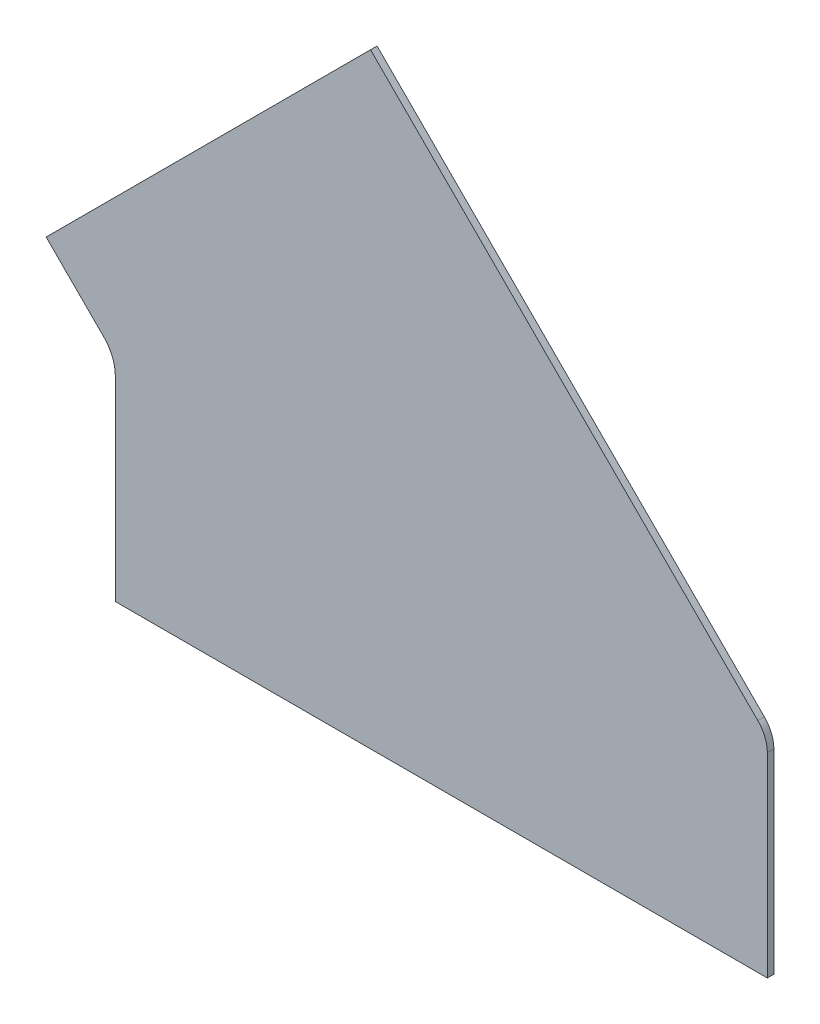
ISO-10303-21;
HEADER;
FILE_DESCRIPTION(('STEP AP214'),'2;1');
FILE_NAME('part.step','',(''),(''),'','','');
FILE_SCHEMA(('AUTOMOTIVE_DESIGN { 1 0 10303 214 1 1 1 1 }'));
ENDSEC;
DATA;
#1=APPLICATION_CONTEXT('core data for automotive mechanical design processes');
#2=APPLICATION_PROTOCOL_DEFINITION('international standard','automotive_design',2000,#1);
#3=PRODUCT_CONTEXT('',#1,'mechanical');
#4=PRODUCT('Part','Part','',(#3));
#5=PRODUCT_RELATED_PRODUCT_CATEGORY('part','',(#4));
#6=PRODUCT_DEFINITION_FORMATION('','',#4);
#7=PRODUCT_DEFINITION_CONTEXT('part definition',#1,'design');
#8=PRODUCT_DEFINITION('design','',#6,#7);
#9=PRODUCT_DEFINITION_SHAPE('','',#8);
#10=(LENGTH_UNIT() NAMED_UNIT(*) SI_UNIT(.MILLI.,.METRE.));
#11=(NAMED_UNIT(*) PLANE_ANGLE_UNIT() SI_UNIT($,.RADIAN.));
#12=(NAMED_UNIT(*) SI_UNIT($,.STERADIAN.) SOLID_ANGLE_UNIT());
#13=UNCERTAINTY_MEASURE_WITH_UNIT(LENGTH_MEASURE(1.E-05),#10,'distance_accuracy_value','');
#14=(GEOMETRIC_REPRESENTATION_CONTEXT(3) GLOBAL_UNCERTAINTY_ASSIGNED_CONTEXT((#13)) GLOBAL_UNIT_ASSIGNED_CONTEXT((#10,
#11,#12)) REPRESENTATION_CONTEXT('',''));
#15=CARTESIAN_POINT('',(0.,0.,0.));
#16=DIRECTION('',(0.,0.,1.));
#17=DIRECTION('',(1.,0.,0.));
#18=AXIS2_PLACEMENT_3D('',#15,#16,#17);
#19=CARTESIAN_POINT('',(0.,65.,2.));
#20=DIRECTION('',(1.,0.,0.));
#21=DIRECTION('',(0.,1.,0.));
#22=AXIS2_PLACEMENT_3D('',#19,#20,#21);
#23=PLANE('',#22);
#24=DIRECTION('',(0.,-1.,0.));
#25=VECTOR('',#24,1.);
#26=CARTESIAN_POINT('',(0.,65.,2.));
#27=LINE('',#26,#25);
#28=CARTESIAN_POINT('',(0.,60.0294372515228,2.));
#29=VERTEX_POINT('',#28);
#30=CARTESIAN_POINT('',(0.,0.,2.));
#31=VERTEX_POINT('',#30);
#32=EDGE_CURVE('E102',#29,#31,#27,.T.);
#33=ORIENTED_EDGE('',*,*,#32,.F.);
#34=DIRECTION('',(0.,0.,-1.));
#35=VECTOR('',#34,1.);
#36=CARTESIAN_POINT('',(0.,60.0294372515228,0.));
#37=LINE('',#36,#35);
#38=CARTESIAN_POINT('',(0.,60.0294372515228,0.));
#39=VERTEX_POINT('',#38);
#40=EDGE_CURVE('E140',#29,#39,#37,.T.);
#41=ORIENTED_EDGE('',*,*,#40,.T.);
#42=DIRECTION('',(0.,-1.,0.));
#43=VECTOR('',#42,1.);
#44=CARTESIAN_POINT('',(0.,65.,0.));
#45=LINE('',#44,#43);
#46=CARTESIAN_POINT('',(0.,0.,0.));
#47=VERTEX_POINT('',#46);
#48=EDGE_CURVE('E124',#39,#47,#45,.T.);
#49=ORIENTED_EDGE('',*,*,#48,.T.);
#50=DIRECTION('',(0.,0.,-1.));
#51=VECTOR('',#50,1.);
#52=CARTESIAN_POINT('',(0.,0.,2.));
#53=LINE('',#52,#51);
#54=EDGE_CURVE('E118',#31,#47,#53,.T.);
#55=ORIENTED_EDGE('',*,*,#54,.F.);
#56=EDGE_LOOP('',(#33,#41,#49,#55));
#57=FACE_BOUND('',#56,.T.);
#58=ADVANCED_FACE('F38',(#57),#23,.F.);
#59=CARTESIAN_POINT('',(0.,0.,2.));
#60=DIRECTION('',(0.,1.,0.));
#61=DIRECTION('',(0.,0.,1.));
#62=AXIS2_PLACEMENT_3D('',#59,#60,#61);
#63=PLANE('',#62);
#64=DIRECTION('',(1.,0.,0.));
#65=VECTOR('',#64,1.);
#66=CARTESIAN_POINT('',(0.,0.,0.));
#67=LINE('',#66,#65);
#68=CARTESIAN_POINT('',(200.,0.,0.));
#69=VERTEX_POINT('',#68);
#70=EDGE_CURVE('E146',#47,#69,#67,.T.);
#71=ORIENTED_EDGE('',*,*,#70,.T.);
#72=DIRECTION('',(0.,0.,-1.));
#73=VECTOR('',#72,1.);
#74=CARTESIAN_POINT('',(200.,0.,2.));
#75=LINE('',#74,#73);
#76=CARTESIAN_POINT('',(200.,0.,2.));
#77=VERTEX_POINT('',#76);
#78=EDGE_CURVE('E120',#77,#69,#75,.T.);
#79=ORIENTED_EDGE('',*,*,#78,.F.);
#80=DIRECTION('',(1.,0.,0.));
#81=VECTOR('',#80,1.);
#82=CARTESIAN_POINT('',(0.,0.,2.));
#83=LINE('',#82,#81);
#84=EDGE_CURVE('E106',#31,#77,#83,.T.);
#85=ORIENTED_EDGE('',*,*,#84,.F.);
#86=ORIENTED_EDGE('',*,*,#54,.T.);
#87=EDGE_LOOP('',(#71,#79,#85,#86));
#88=FACE_BOUND('',#87,.T.);
#89=ADVANCED_FACE('F117',(#88),#63,.F.);
#90=CARTESIAN_POINT('',(200.,0.,2.));
#91=DIRECTION('',(-1.,0.,0.));
#92=DIRECTION('',(0.,-1.,0.));
#93=AXIS2_PLACEMENT_3D('',#90,#91,#92);
#94=PLANE('',#93);
#95=DIRECTION('',(0.,1.,0.));
#96=VECTOR('',#95,1.);
#97=CARTESIAN_POINT('',(200.,0.,0.));
#98=LINE('',#97,#96);
#99=CARTESIAN_POINT('',(200.,59.857864376269,0.));
#100=VERTEX_POINT('',#99);
#101=EDGE_CURVE('E148',#69,#100,#98,.T.);
#102=ORIENTED_EDGE('',*,*,#101,.T.);
#103=DIRECTION('',(0.,0.,-1.));
#104=VECTOR('',#103,1.);
#105=CARTESIAN_POINT('',(200.,59.857864376269,2.));
#106=LINE('',#105,#104);
#107=CARTESIAN_POINT('',(200.,59.857864376269,2.));
#108=VERTEX_POINT('',#107);
#109=EDGE_CURVE('E136',#100,#108,#106,.F.);
#110=ORIENTED_EDGE('',*,*,#109,.T.);
#111=DIRECTION('',(0.,1.,0.));
#112=VECTOR('',#111,1.);
#113=CARTESIAN_POINT('',(200.,0.,2.));
#114=LINE('',#113,#112);
#115=EDGE_CURVE('E122',#77,#108,#114,.T.);
#116=ORIENTED_EDGE('',*,*,#115,.F.);
#117=ORIENTED_EDGE('',*,*,#78,.T.);
#118=EDGE_LOOP('',(#102,#110,#116,#117));
#119=FACE_BOUND('',#118,.T.);
#120=ADVANCED_FACE('F185',(#119),#94,.F.);
#121=CARTESIAN_POINT('',(78.2867965644022,185.713203435596,2.));
#122=DIRECTION('',(-0.707106781186543,-0.707106781186552,0.));
#123=DIRECTION('',(0.707106781186552,-0.707106781186543,0.));
#124=AXIS2_PLACEMENT_3D('',#121,#122,#123);
#125=PLANE('',#124);
#126=DIRECTION('',(-0.707106781186552,0.707106781186543,0.));
#127=VECTOR('',#126,1.);
#128=CARTESIAN_POINT('',(78.2867965644022,185.713203435596,2.));
#129=LINE('',#128,#127);
#130=CARTESIAN_POINT('',(197.071067811865,66.9289321881345,2.));
#131=VERTEX_POINT('',#130);
#132=CARTESIAN_POINT('',(78.2867965644022,185.713203435596,2.));
#133=VERTEX_POINT('',#132);
#134=EDGE_CURVE('E257',#131,#133,#129,.T.);
#135=ORIENTED_EDGE('',*,*,#134,.F.);
#136=DIRECTION('',(0.,0.,-1.));
#137=VECTOR('',#136,1.);
#138=CARTESIAN_POINT('',(197.071067811865,66.9289321881346,2.));
#139=LINE('',#138,#137);
#140=CARTESIAN_POINT('',(197.071067811865,66.9289321881345,0.));
#141=VERTEX_POINT('',#140);
#142=EDGE_CURVE('E126',#131,#141,#139,.T.);
#143=ORIENTED_EDGE('',*,*,#142,.T.);
#144=DIRECTION('',(-0.707106781186552,0.707106781186543,0.));
#145=VECTOR('',#144,1.);
#146=CARTESIAN_POINT('',(78.2867965644022,185.713203435596,0.));
#147=LINE('',#146,#145);
#148=CARTESIAN_POINT('',(78.2867965644022,185.713203435596,0.));
#149=VERTEX_POINT('',#148);
#150=EDGE_CURVE('E156',#141,#149,#147,.T.);
#151=ORIENTED_EDGE('',*,*,#150,.T.);
#152=DIRECTION('',(0.,0.,-1.));
#153=VECTOR('',#152,1.);
#154=CARTESIAN_POINT('',(78.2867965644022,185.713203435596,2.));
#155=LINE('',#154,#153);
#156=EDGE_CURVE('E131',#133,#149,#155,.T.);
#157=ORIENTED_EDGE('',*,*,#156,.F.);
#158=EDGE_LOOP('',(#135,#143,#151,#157));
#159=FACE_BOUND('',#158,.T.);
#160=ADVANCED_FACE('F190',(#159),#125,.F.);
#161=CARTESIAN_POINT('',(-21.2132034355966,86.2132034355963,2.));
#162=DIRECTION('',(0.707106781186552,-0.707106781186543,0.));
#163=DIRECTION('',(0.707106781186543,0.707106781186552,0.));
#164=AXIS2_PLACEMENT_3D('',#161,#162,#163);
#165=PLANE('',#164);
#166=DIRECTION('',(-0.707106781186543,-0.707106781186552,0.));
#167=VECTOR('',#166,1.);
#168=CARTESIAN_POINT('',(-21.2132034355966,86.2132034355963,0.));
#169=LINE('',#168,#167);
#170=CARTESIAN_POINT('',(-21.2132034355966,86.2132034355963,0.));
#171=VERTEX_POINT('',#170);
#172=EDGE_CURVE('E158',#149,#171,#169,.T.);
#173=ORIENTED_EDGE('',*,*,#172,.T.);
#174=DIRECTION('',(0.,0.,-1.));
#175=VECTOR('',#174,1.);
#176=CARTESIAN_POINT('',(-21.2132034355966,86.2132034355963,2.));
#177=LINE('',#176,#175);
#178=CARTESIAN_POINT('',(-21.2132034355966,86.2132034355963,2.));
#179=VERTEX_POINT('',#178);
#180=EDGE_CURVE('E161',#179,#171,#177,.T.);
#181=ORIENTED_EDGE('',*,*,#180,.F.);
#182=DIRECTION('',(-0.707106781186543,-0.707106781186552,0.));
#183=VECTOR('',#182,1.);
#184=CARTESIAN_POINT('',(-21.2132034355966,86.2132034355963,2.));
#185=LINE('',#184,#183);
#186=EDGE_CURVE('E170',#133,#179,#185,.T.);
#187=ORIENTED_EDGE('',*,*,#186,.F.);
#188=ORIENTED_EDGE('',*,*,#156,.T.);
#189=EDGE_LOOP('',(#173,#181,#187,#188));
#190=FACE_BOUND('',#189,.T.);
#191=ADVANCED_FACE('F168',(#190),#165,.F.);
#192=CARTESIAN_POINT('',(0.,65.,2.));
#193=DIRECTION('',(0.707106781186543,0.707106781186552,0.));
#194=DIRECTION('',(-0.707106781186552,0.707106781186543,0.));
#195=AXIS2_PLACEMENT_3D('',#192,#193,#194);
#196=PLANE('',#195);
#197=DIRECTION('',(0.707106781186552,-0.707106781186543,0.));
#198=VECTOR('',#197,1.);
#199=CARTESIAN_POINT('',(0.,65.,0.));
#200=LINE('',#199,#198);
#201=CARTESIAN_POINT('',(-3.51471862576148,68.5147186257614,0.));
#202=VERTEX_POINT('',#201);
#203=EDGE_CURVE('E113',#171,#202,#200,.T.);
#204=ORIENTED_EDGE('',*,*,#203,.T.);
#205=DIRECTION('',(0.,0.,-1.));
#206=VECTOR('',#205,1.);
#207=CARTESIAN_POINT('',(-3.51471862576148,68.5147186257614,2.));
#208=LINE('',#207,#206);
#209=CARTESIAN_POINT('',(-3.51471862576148,68.5147186257614,2.));
#210=VERTEX_POINT('',#209);
#211=EDGE_CURVE('E53',#202,#210,#208,.F.);
#212=ORIENTED_EDGE('',*,*,#211,.T.);
#213=DIRECTION('',(0.707106781186552,-0.707106781186543,0.));
#214=VECTOR('',#213,1.);
#215=CARTESIAN_POINT('',(0.,65.,2.));
#216=LINE('',#215,#214);
#217=EDGE_CURVE('E151',#179,#210,#216,.T.);
#218=ORIENTED_EDGE('',*,*,#217,.F.);
#219=ORIENTED_EDGE('',*,*,#180,.T.);
#220=EDGE_LOOP('',(#204,#212,#218,#219));
#221=FACE_BOUND('',#220,.T.);
#222=ADVANCED_FACE('F173',(#221),#196,.F.);
#223=CARTESIAN_POINT('',(0.,0.,2.));
#224=DIRECTION('',(0.,0.,1.));
#225=DIRECTION('',(1.,0.,0.));
#226=AXIS2_PLACEMENT_3D('',#223,#224,#225);
#227=PLANE('',#226);
#228=ORIENTED_EDGE('',*,*,#115,.T.);
#229=CARTESIAN_POINT('',(190.,59.857864376269,2.));
#230=DIRECTION('',(0.,0.,1.));
#231=DIRECTION('',(1.,0.,0.));
#232=AXIS2_PLACEMENT_3D('',#229,#230,#231);
#233=CIRCLE('',#232,10.);
#234=EDGE_CURVE('E138',#108,#131,#233,.T.);
#235=ORIENTED_EDGE('',*,*,#234,.T.);
#236=ORIENTED_EDGE('',*,*,#134,.T.);
#237=ORIENTED_EDGE('',*,*,#186,.T.);
#238=ORIENTED_EDGE('',*,*,#217,.T.);
#239=CARTESIAN_POINT('',(-12.,60.0294372515228,2.));
#240=DIRECTION('',(0.,0.,1.));
#241=DIRECTION('',(1.,0.,0.));
#242=AXIS2_PLACEMENT_3D('',#239,#240,#241);
#243=CIRCLE('',#242,12.);
#244=EDGE_CURVE('E11',#210,#29,#243,.F.);
#245=ORIENTED_EDGE('',*,*,#244,.T.);
#246=ORIENTED_EDGE('',*,*,#32,.T.);
#247=ORIENTED_EDGE('',*,*,#84,.T.);
#248=EDGE_LOOP('',(#228,#235,#236,#237,#238,#245,#246,#247));
#249=FACE_BOUND('',#248,.T.);
#250=ADVANCED_FACE('F105',(#249),#227,.T.);
#251=CARTESIAN_POINT('',(0.,0.,0.));
#252=DIRECTION('',(0.,0.,1.));
#253=DIRECTION('',(1.,0.,0.));
#254=AXIS2_PLACEMENT_3D('',#251,#252,#253);
#255=PLANE('',#254);
#256=ORIENTED_EDGE('',*,*,#150,.F.);
#257=CARTESIAN_POINT('',(190.,59.857864376269,0.));
#258=DIRECTION('',(0.,0.,1.));
#259=DIRECTION('',(1.,0.,0.));
#260=AXIS2_PLACEMENT_3D('',#257,#258,#259);
#261=CIRCLE('',#260,10.);
#262=EDGE_CURVE('E129',#141,#100,#261,.F.);
#263=ORIENTED_EDGE('',*,*,#262,.T.);
#264=ORIENTED_EDGE('',*,*,#101,.F.);
#265=ORIENTED_EDGE('',*,*,#70,.F.);
#266=ORIENTED_EDGE('',*,*,#48,.F.);
#267=CARTESIAN_POINT('',(-12.,60.0294372515228,0.));
#268=DIRECTION('',(0.,0.,1.));
#269=DIRECTION('',(1.,0.,0.));
#270=AXIS2_PLACEMENT_3D('',#267,#268,#269);
#271=CIRCLE('',#270,12.);
#272=EDGE_CURVE('E46',#39,#202,#271,.T.);
#273=ORIENTED_EDGE('',*,*,#272,.T.);
#274=ORIENTED_EDGE('',*,*,#203,.F.);
#275=ORIENTED_EDGE('',*,*,#172,.F.);
#276=EDGE_LOOP('',(#256,#263,#264,#265,#266,#273,#274,#275));
#277=FACE_BOUND('',#276,.T.);
#278=ADVANCED_FACE('F144',(#277),#255,.F.);
#279=CARTESIAN_POINT('',(190.,59.857864376269,2.));
#280=DIRECTION('',(0.,0.,-1.));
#281=DIRECTION('',(-1.,0.,0.));
#282=AXIS2_PLACEMENT_3D('',#279,#280,#281);
#283=CYLINDRICAL_SURFACE('',#282,10.);
#284=ORIENTED_EDGE('',*,*,#234,.F.);
#285=ORIENTED_EDGE('',*,*,#109,.F.);
#286=ORIENTED_EDGE('',*,*,#262,.F.);
#287=ORIENTED_EDGE('',*,*,#142,.F.);
#288=EDGE_LOOP('',(#284,#285,#286,#287));
#289=FACE_BOUND('',#288,.T.);
#290=ADVANCED_FACE('F175',(#289),#283,.T.);
#291=CARTESIAN_POINT('',(-12.,60.0294372515228,2.));
#292=DIRECTION('',(0.,0.,1.));
#293=DIRECTION('',(1.,0.,0.));
#294=AXIS2_PLACEMENT_3D('',#291,#292,#293);
#295=CYLINDRICAL_SURFACE('',#294,12.);
#296=ORIENTED_EDGE('',*,*,#244,.F.);
#297=ORIENTED_EDGE('',*,*,#211,.F.);
#298=ORIENTED_EDGE('',*,*,#272,.F.);
#299=ORIENTED_EDGE('',*,*,#40,.F.);
#300=EDGE_LOOP('',(#296,#297,#298,#299));
#301=FACE_BOUND('',#300,.T.);
#302=ADVANCED_FACE('F40',(#301),#295,.F.);
#303=CLOSED_SHELL('',(#58,#89,#120,#160,#191,#222,#250,#278,#290,#302));
#304=MANIFOLD_SOLID_BREP('B2',#303);
#305=ADVANCED_BREP_SHAPE_REPRESENTATION('',(#18,#304),#14);
#306=SHAPE_DEFINITION_REPRESENTATION(#9,#305);
ENDSEC;
END-ISO-10303-21;
